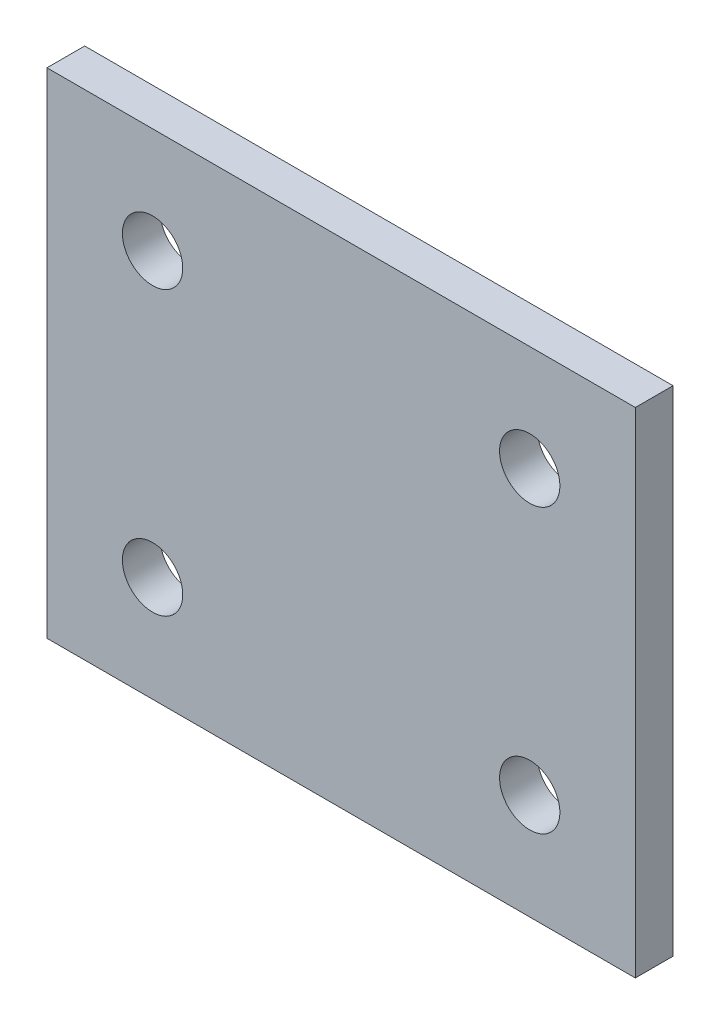
ISO-10303-21;
HEADER;
FILE_DESCRIPTION(('STEP AP214'),'2;1');
FILE_NAME('part.step','',(''),(''),'','','');
FILE_SCHEMA(('AUTOMOTIVE_DESIGN { 1 0 10303 214 1 1 1 1 }'));
ENDSEC;
DATA;
#1=APPLICATION_CONTEXT('core data for automotive mechanical design processes');
#2=APPLICATION_PROTOCOL_DEFINITION('international standard','automotive_design',2000,#1);
#3=PRODUCT_CONTEXT('',#1,'mechanical');
#4=PRODUCT('Part','Part','',(#3));
#5=PRODUCT_RELATED_PRODUCT_CATEGORY('part','',(#4));
#6=PRODUCT_DEFINITION_FORMATION('','',#4);
#7=PRODUCT_DEFINITION_CONTEXT('part definition',#1,'design');
#8=PRODUCT_DEFINITION('design','',#6,#7);
#9=PRODUCT_DEFINITION_SHAPE('','',#8);
#10=(LENGTH_UNIT() NAMED_UNIT(*) SI_UNIT(.MILLI.,.METRE.));
#11=(NAMED_UNIT(*) PLANE_ANGLE_UNIT() SI_UNIT($,.RADIAN.));
#12=(NAMED_UNIT(*) SI_UNIT($,.STERADIAN.) SOLID_ANGLE_UNIT());
#13=UNCERTAINTY_MEASURE_WITH_UNIT(LENGTH_MEASURE(1.E-05),#10,'distance_accuracy_value','');
#14=(GEOMETRIC_REPRESENTATION_CONTEXT(3) GLOBAL_UNCERTAINTY_ASSIGNED_CONTEXT((#13)) GLOBAL_UNIT_ASSIGNED_CONTEXT((#10,
#11,#12)) REPRESENTATION_CONTEXT('',''));
#15=CARTESIAN_POINT('',(0.,0.,0.));
#16=DIRECTION('',(0.,0.,1.));
#17=DIRECTION('',(1.,0.,0.));
#18=AXIS2_PLACEMENT_3D('',#15,#16,#17);
#19=CARTESIAN_POINT('',(0.,0.,2.));
#20=DIRECTION('',(0.,0.,-1.));
#21=DIRECTION('',(-1.,0.,0.));
#22=AXIS2_PLACEMENT_3D('',#19,#20,#21);
#23=PLANE('',#22);
#24=DIRECTION('',(0.,1.,0.));
#25=VECTOR('',#24,1.);
#26=CARTESIAN_POINT('',(15.6,-13.1,2.));
#27=LINE('',#26,#25);
#28=CARTESIAN_POINT('',(15.6,-13.1,2.));
#29=VERTEX_POINT('',#28);
#30=CARTESIAN_POINT('',(15.6,13.1,2.));
#31=VERTEX_POINT('',#30);
#32=EDGE_CURVE('E96',#29,#31,#27,.T.);
#33=ORIENTED_EDGE('',*,*,#32,.T.);
#34=DIRECTION('',(-1.,0.,0.));
#35=VECTOR('',#34,1.);
#36=CARTESIAN_POINT('',(-15.6,13.1,2.));
#37=LINE('',#36,#35);
#38=CARTESIAN_POINT('',(-15.6,13.1,2.));
#39=VERTEX_POINT('',#38);
#40=EDGE_CURVE('E91',#31,#39,#37,.T.);
#41=ORIENTED_EDGE('',*,*,#40,.T.);
#42=DIRECTION('',(0.,-1.,0.));
#43=VECTOR('',#42,1.);
#44=CARTESIAN_POINT('',(-15.6,-13.1,2.));
#45=LINE('',#44,#43);
#46=CARTESIAN_POINT('',(-15.6,-13.1,2.));
#47=VERTEX_POINT('',#46);
#48=EDGE_CURVE('E94',#39,#47,#45,.T.);
#49=ORIENTED_EDGE('',*,*,#48,.T.);
#50=DIRECTION('',(1.,0.,0.));
#51=VECTOR('',#50,1.);
#52=CARTESIAN_POINT('',(-15.6,-13.1,2.));
#53=LINE('',#52,#51);
#54=EDGE_CURVE('E61',#47,#29,#53,.T.);
#55=ORIENTED_EDGE('',*,*,#54,.T.);
#56=EDGE_LOOP('',(#33,#41,#49,#55));
#57=FACE_BOUND('',#56,.T.);
#58=CARTESIAN_POINT('',(-10.,7.5,2.));
#59=DIRECTION('',(0.,0.,1.));
#60=DIRECTION('',(1.,0.,0.));
#61=AXIS2_PLACEMENT_3D('',#58,#59,#60);
#62=CIRCLE('',#61,1.6);
#63=CARTESIAN_POINT('',(-8.4,7.5,2.));
#64=VERTEX_POINT('',#63);
#65=EDGE_CURVE('E116',#64,#64,#62,.T.);
#66=ORIENTED_EDGE('',*,*,#65,.F.);
#67=EDGE_LOOP('',(#66));
#68=FACE_BOUND('',#67,.T.);
#69=CARTESIAN_POINT('',(10.,7.5,2.));
#70=DIRECTION('',(0.,0.,1.));
#71=DIRECTION('',(1.,0.,0.));
#72=AXIS2_PLACEMENT_3D('',#69,#70,#71);
#73=CIRCLE('',#72,1.6);
#74=CARTESIAN_POINT('',(11.6,7.5,2.));
#75=VERTEX_POINT('',#74);
#76=EDGE_CURVE('E138',#75,#75,#73,.T.);
#77=ORIENTED_EDGE('',*,*,#76,.F.);
#78=EDGE_LOOP('',(#77));
#79=FACE_BOUND('',#78,.T.);
#80=CARTESIAN_POINT('',(-10.,-7.5,2.));
#81=DIRECTION('',(0.,0.,1.));
#82=DIRECTION('',(1.,0.,0.));
#83=AXIS2_PLACEMENT_3D('',#80,#81,#82);
#84=CIRCLE('',#83,1.6);
#85=CARTESIAN_POINT('',(-8.4,-7.5,2.));
#86=VERTEX_POINT('',#85);
#87=EDGE_CURVE('E146',#86,#86,#84,.T.);
#88=ORIENTED_EDGE('',*,*,#87,.F.);
#89=EDGE_LOOP('',(#88));
#90=FACE_BOUND('',#89,.T.);
#91=CARTESIAN_POINT('',(10.,-7.5,2.));
#92=DIRECTION('',(0.,0.,1.));
#93=DIRECTION('',(1.,0.,0.));
#94=AXIS2_PLACEMENT_3D('',#91,#92,#93);
#95=CIRCLE('',#94,1.6);
#96=CARTESIAN_POINT('',(11.6,-7.5,2.));
#97=VERTEX_POINT('',#96);
#98=EDGE_CURVE('E154',#97,#97,#95,.T.);
#99=ORIENTED_EDGE('',*,*,#98,.F.);
#100=EDGE_LOOP('',(#99));
#101=FACE_BOUND('',#100,.T.);
#102=ADVANCED_FACE('F43',(#57,#68,#79,#90,#101),#23,.F.);
#103=CARTESIAN_POINT('',(0.,0.,0.));
#104=DIRECTION('',(0.,0.,-1.));
#105=DIRECTION('',(-1.,0.,0.));
#106=AXIS2_PLACEMENT_3D('',#103,#104,#105);
#107=PLANE('',#106);
#108=CARTESIAN_POINT('',(-10.,-7.5,0.));
#109=DIRECTION('',(0.,0.,1.));
#110=DIRECTION('',(1.,0.,0.));
#111=AXIS2_PLACEMENT_3D('',#108,#109,#110);
#112=CIRCLE('',#111,1.6);
#113=CARTESIAN_POINT('',(-8.4,-7.5,0.));
#114=VERTEX_POINT('',#113);
#115=EDGE_CURVE('E150',#114,#114,#112,.T.);
#116=ORIENTED_EDGE('',*,*,#115,.T.);
#117=EDGE_LOOP('',(#116));
#118=FACE_BOUND('',#117,.T.);
#119=CARTESIAN_POINT('',(-10.,7.5,0.));
#120=DIRECTION('',(0.,0.,1.));
#121=DIRECTION('',(1.,0.,0.));
#122=AXIS2_PLACEMENT_3D('',#119,#120,#121);
#123=CIRCLE('',#122,1.6);
#124=CARTESIAN_POINT('',(-8.4,7.5,0.));
#125=VERTEX_POINT('',#124);
#126=EDGE_CURVE('E134',#125,#125,#123,.T.);
#127=ORIENTED_EDGE('',*,*,#126,.T.);
#128=EDGE_LOOP('',(#127));
#129=FACE_BOUND('',#128,.T.);
#130=DIRECTION('',(0.,1.,0.));
#131=VECTOR('',#130,1.);
#132=CARTESIAN_POINT('',(15.6,-13.1,0.));
#133=LINE('',#132,#131);
#134=CARTESIAN_POINT('',(15.6,-13.1,0.));
#135=VERTEX_POINT('',#134);
#136=CARTESIAN_POINT('',(15.6,13.1,0.));
#137=VERTEX_POINT('',#136);
#138=EDGE_CURVE('E112',#135,#137,#133,.T.);
#139=ORIENTED_EDGE('',*,*,#138,.F.);
#140=DIRECTION('',(1.,0.,0.));
#141=VECTOR('',#140,1.);
#142=CARTESIAN_POINT('',(-15.6,-13.1,0.));
#143=LINE('',#142,#141);
#144=CARTESIAN_POINT('',(-15.6,-13.1,0.));
#145=VERTEX_POINT('',#144);
#146=EDGE_CURVE('E84',#145,#135,#143,.T.);
#147=ORIENTED_EDGE('',*,*,#146,.F.);
#148=DIRECTION('',(0.,-1.,0.));
#149=VECTOR('',#148,1.);
#150=CARTESIAN_POINT('',(-15.6,-13.1,0.));
#151=LINE('',#150,#149);
#152=CARTESIAN_POINT('',(-15.6,13.1,0.));
#153=VERTEX_POINT('',#152);
#154=EDGE_CURVE('E78',#153,#145,#151,.T.);
#155=ORIENTED_EDGE('',*,*,#154,.F.);
#156=DIRECTION('',(-1.,0.,0.));
#157=VECTOR('',#156,1.);
#158=CARTESIAN_POINT('',(-15.6,13.1,0.));
#159=LINE('',#158,#157);
#160=EDGE_CURVE('E101',#137,#153,#159,.T.);
#161=ORIENTED_EDGE('',*,*,#160,.F.);
#162=EDGE_LOOP('',(#139,#147,#155,#161));
#163=FACE_BOUND('',#162,.T.);
#164=CARTESIAN_POINT('',(10.,7.5,0.));
#165=DIRECTION('',(0.,0.,1.));
#166=DIRECTION('',(1.,0.,0.));
#167=AXIS2_PLACEMENT_3D('',#164,#165,#166);
#168=CIRCLE('',#167,1.6);
#169=CARTESIAN_POINT('',(11.6,7.5,0.));
#170=VERTEX_POINT('',#169);
#171=EDGE_CURVE('E142',#170,#170,#168,.T.);
#172=ORIENTED_EDGE('',*,*,#171,.T.);
#173=EDGE_LOOP('',(#172));
#174=FACE_BOUND('',#173,.T.);
#175=CARTESIAN_POINT('',(10.,-7.5,0.));
#176=DIRECTION('',(0.,0.,1.));
#177=DIRECTION('',(1.,0.,0.));
#178=AXIS2_PLACEMENT_3D('',#175,#176,#177);
#179=CIRCLE('',#178,1.6);
#180=CARTESIAN_POINT('',(11.6,-7.5,0.));
#181=VERTEX_POINT('',#180);
#182=EDGE_CURVE('E158',#181,#181,#179,.T.);
#183=ORIENTED_EDGE('',*,*,#182,.T.);
#184=EDGE_LOOP('',(#183));
#185=FACE_BOUND('',#184,.T.);
#186=ADVANCED_FACE('F129',(#118,#129,#163,#174,#185),#107,.T.);
#187=CARTESIAN_POINT('',(15.6,-13.1,2.));
#188=DIRECTION('',(-1.,0.,0.));
#189=DIRECTION('',(0.,0.,1.));
#190=AXIS2_PLACEMENT_3D('',#187,#188,#189);
#191=PLANE('',#190);
#192=ORIENTED_EDGE('',*,*,#138,.T.);
#193=DIRECTION('',(0.,0.,-1.));
#194=VECTOR('',#193,1.);
#195=CARTESIAN_POINT('',(15.6,13.1,2.));
#196=LINE('',#195,#194);
#197=EDGE_CURVE('E11',#31,#137,#196,.T.);
#198=ORIENTED_EDGE('',*,*,#197,.F.);
#199=ORIENTED_EDGE('',*,*,#32,.F.);
#200=DIRECTION('',(0.,0.,-1.));
#201=VECTOR('',#200,1.);
#202=CARTESIAN_POINT('',(15.6,-13.1,2.));
#203=LINE('',#202,#201);
#204=EDGE_CURVE('E108',#29,#135,#203,.T.);
#205=ORIENTED_EDGE('',*,*,#204,.T.);
#206=EDGE_LOOP('',(#192,#198,#199,#205));
#207=FACE_BOUND('',#206,.T.);
#208=ADVANCED_FACE('F45',(#207),#191,.F.);
#209=CARTESIAN_POINT('',(-15.6,13.1,2.));
#210=DIRECTION('',(0.,-1.,0.));
#211=DIRECTION('',(0.,0.,-1.));
#212=AXIS2_PLACEMENT_3D('',#209,#210,#211);
#213=PLANE('',#212);
#214=ORIENTED_EDGE('',*,*,#160,.T.);
#215=DIRECTION('',(0.,0.,-1.));
#216=VECTOR('',#215,1.);
#217=CARTESIAN_POINT('',(-15.6,13.1,2.));
#218=LINE('',#217,#216);
#219=EDGE_CURVE('E53',#39,#153,#218,.T.);
#220=ORIENTED_EDGE('',*,*,#219,.F.);
#221=ORIENTED_EDGE('',*,*,#40,.F.);
#222=ORIENTED_EDGE('',*,*,#197,.T.);
#223=EDGE_LOOP('',(#214,#220,#221,#222));
#224=FACE_BOUND('',#223,.T.);
#225=ADVANCED_FACE('F100',(#224),#213,.F.);
#226=CARTESIAN_POINT('',(-15.6,-13.1,2.));
#227=DIRECTION('',(1.,0.,0.));
#228=DIRECTION('',(0.,0.,-1.));
#229=AXIS2_PLACEMENT_3D('',#226,#227,#228);
#230=PLANE('',#229);
#231=ORIENTED_EDGE('',*,*,#154,.T.);
#232=DIRECTION('',(0.,0.,-1.));
#233=VECTOR('',#232,1.);
#234=CARTESIAN_POINT('',(-15.6,-13.1,2.));
#235=LINE('',#234,#233);
#236=EDGE_CURVE('E103',#47,#145,#235,.T.);
#237=ORIENTED_EDGE('',*,*,#236,.F.);
#238=ORIENTED_EDGE('',*,*,#48,.F.);
#239=ORIENTED_EDGE('',*,*,#219,.T.);
#240=EDGE_LOOP('',(#231,#237,#238,#239));
#241=FACE_BOUND('',#240,.T.);
#242=ADVANCED_FACE('F104',(#241),#230,.F.);
#243=CARTESIAN_POINT('',(-15.6,-13.1,2.));
#244=DIRECTION('',(0.,1.,0.));
#245=DIRECTION('',(0.,0.,1.));
#246=AXIS2_PLACEMENT_3D('',#243,#244,#245);
#247=PLANE('',#246);
#248=ORIENTED_EDGE('',*,*,#146,.T.);
#249=ORIENTED_EDGE('',*,*,#204,.F.);
#250=ORIENTED_EDGE('',*,*,#54,.F.);
#251=ORIENTED_EDGE('',*,*,#236,.T.);
#252=EDGE_LOOP('',(#248,#249,#250,#251));
#253=FACE_BOUND('',#252,.T.);
#254=ADVANCED_FACE('F126',(#253),#247,.F.);
#255=CARTESIAN_POINT('',(-10.,7.5,2.));
#256=DIRECTION('',(0.,0.,-1.));
#257=DIRECTION('',(-1.,0.,0.));
#258=AXIS2_PLACEMENT_3D('',#255,#256,#257);
#259=CYLINDRICAL_SURFACE('',#258,1.6);
#260=ORIENTED_EDGE('',*,*,#65,.T.);
#261=EDGE_LOOP('',(#260));
#262=FACE_BOUND('',#261,.T.);
#263=ORIENTED_EDGE('',*,*,#126,.F.);
#264=EDGE_LOOP('',(#263));
#265=FACE_BOUND('',#264,.T.);
#266=ADVANCED_FACE('F177',(#262,#265),#259,.F.);
#267=CARTESIAN_POINT('',(10.,7.5,2.));
#268=DIRECTION('',(0.,0.,-1.));
#269=DIRECTION('',(-1.,0.,0.));
#270=AXIS2_PLACEMENT_3D('',#267,#268,#269);
#271=CYLINDRICAL_SURFACE('',#270,1.6);
#272=ORIENTED_EDGE('',*,*,#76,.T.);
#273=EDGE_LOOP('',(#272));
#274=FACE_BOUND('',#273,.T.);
#275=ORIENTED_EDGE('',*,*,#171,.F.);
#276=EDGE_LOOP('',(#275));
#277=FACE_BOUND('',#276,.T.);
#278=ADVANCED_FACE('F231',(#274,#277),#271,.F.);
#279=CARTESIAN_POINT('',(-10.,-7.5,2.));
#280=DIRECTION('',(0.,0.,-1.));
#281=DIRECTION('',(-1.,0.,0.));
#282=AXIS2_PLACEMENT_3D('',#279,#280,#281);
#283=CYLINDRICAL_SURFACE('',#282,1.6);
#284=ORIENTED_EDGE('',*,*,#87,.T.);
#285=EDGE_LOOP('',(#284));
#286=FACE_BOUND('',#285,.T.);
#287=ORIENTED_EDGE('',*,*,#115,.F.);
#288=EDGE_LOOP('',(#287));
#289=FACE_BOUND('',#288,.T.);
#290=ADVANCED_FACE('F240',(#286,#289),#283,.F.);
#291=CARTESIAN_POINT('',(10.,-7.5,2.));
#292=DIRECTION('',(0.,0.,-1.));
#293=DIRECTION('',(-1.,0.,0.));
#294=AXIS2_PLACEMENT_3D('',#291,#292,#293);
#295=CYLINDRICAL_SURFACE('',#294,1.6);
#296=ORIENTED_EDGE('',*,*,#98,.T.);
#297=EDGE_LOOP('',(#296));
#298=FACE_BOUND('',#297,.T.);
#299=ORIENTED_EDGE('',*,*,#182,.F.);
#300=EDGE_LOOP('',(#299));
#301=FACE_BOUND('',#300,.T.);
#302=ADVANCED_FACE('F166',(#298,#301),#295,.F.);
#303=CLOSED_SHELL('',(#102,#186,#208,#225,#242,#254,#266,#278,#290,#302));
#304=MANIFOLD_SOLID_BREP('B2',#303);
#305=ADVANCED_BREP_SHAPE_REPRESENTATION('',(#18,#304),#14);
#306=SHAPE_DEFINITION_REPRESENTATION(#9,#305);
ENDSEC;
END-ISO-10303-21;
